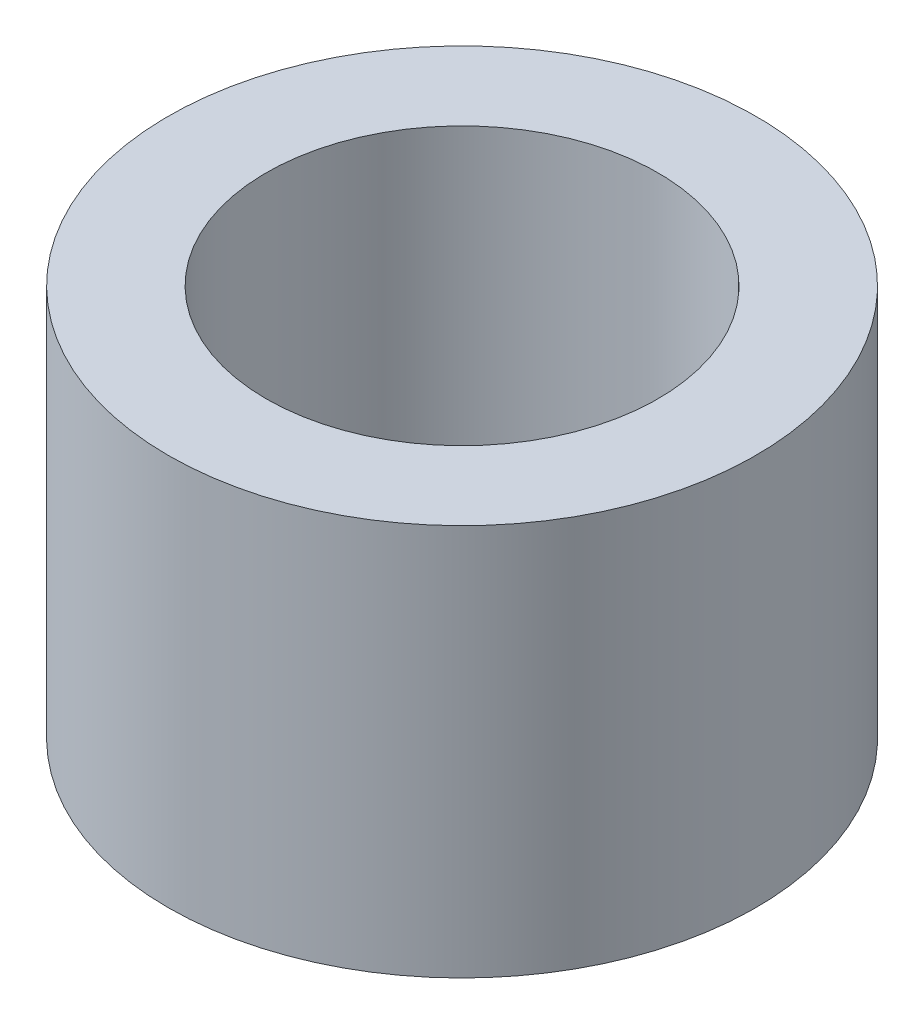
ISO-10303-21;
HEADER;
FILE_DESCRIPTION(('STEP AP214'),'2;1');
FILE_NAME('part.step','',(''),(''),'','','');
FILE_SCHEMA(('AUTOMOTIVE_DESIGN { 1 0 10303 214 1 1 1 1 }'));
ENDSEC;
DATA;
#1=APPLICATION_CONTEXT('core data for automotive mechanical design processes');
#2=APPLICATION_PROTOCOL_DEFINITION('international standard','automotive_design',2000,#1);
#3=PRODUCT_CONTEXT('',#1,'mechanical');
#4=PRODUCT('Part','Part','',(#3));
#5=PRODUCT_RELATED_PRODUCT_CATEGORY('part','',(#4));
#6=PRODUCT_DEFINITION_FORMATION('','',#4);
#7=PRODUCT_DEFINITION_CONTEXT('part definition',#1,'design');
#8=PRODUCT_DEFINITION('design','',#6,#7);
#9=PRODUCT_DEFINITION_SHAPE('','',#8);
#10=(LENGTH_UNIT() NAMED_UNIT(*) SI_UNIT(.MILLI.,.METRE.));
#11=(NAMED_UNIT(*) PLANE_ANGLE_UNIT() SI_UNIT($,.RADIAN.));
#12=(NAMED_UNIT(*) SI_UNIT($,.STERADIAN.) SOLID_ANGLE_UNIT());
#13=UNCERTAINTY_MEASURE_WITH_UNIT(LENGTH_MEASURE(1.E-05),#10,'distance_accuracy_value','');
#14=(GEOMETRIC_REPRESENTATION_CONTEXT(3) GLOBAL_UNCERTAINTY_ASSIGNED_CONTEXT((#13)) GLOBAL_UNIT_ASSIGNED_CONTEXT((#10,
#11,#12)) REPRESENTATION_CONTEXT('',''));
#15=CARTESIAN_POINT('',(0.,0.,0.));
#16=DIRECTION('',(0.,0.,1.));
#17=DIRECTION('',(1.,0.,0.));
#18=AXIS2_PLACEMENT_3D('',#15,#16,#17);
#19=CARTESIAN_POINT('',(0.,8.,0.));
#20=DIRECTION('',(0.,1.,0.));
#21=DIRECTION('',(0.,0.,1.));
#22=AXIS2_PLACEMENT_3D('',#19,#20,#21);
#23=PLANE('',#22);
#24=CARTESIAN_POINT('',(0.,8.,0.));
#25=DIRECTION('',(0.,1.,0.));
#26=DIRECTION('',(0.,0.,1.));
#27=AXIS2_PLACEMENT_3D('',#24,#25,#26);
#28=CIRCLE('',#27,6.);
#29=CARTESIAN_POINT('',(0.,8.,6.));
#30=VERTEX_POINT('',#29);
#31=EDGE_CURVE('E10',#30,#30,#28,.T.);
#32=ORIENTED_EDGE('',*,*,#31,.T.);
#33=EDGE_LOOP('',(#32));
#34=FACE_BOUND('',#33,.T.);
#35=CARTESIAN_POINT('',(0.,8.,0.));
#36=DIRECTION('',(0.,1.,0.));
#37=DIRECTION('',(0.,0.,1.));
#38=AXIS2_PLACEMENT_3D('',#35,#36,#37);
#39=CIRCLE('',#38,4.);
#40=CARTESIAN_POINT('',(0.,8.,4.));
#41=VERTEX_POINT('',#40);
#42=EDGE_CURVE('E48',#41,#41,#39,.T.);
#43=ORIENTED_EDGE('',*,*,#42,.F.);
#44=EDGE_LOOP('',(#43));
#45=FACE_BOUND('',#44,.T.);
#46=ADVANCED_FACE('F37',(#34,#45),#23,.T.);
#47=CARTESIAN_POINT('',(0.,0.,0.));
#48=DIRECTION('',(0.,1.,0.));
#49=DIRECTION('',(0.,0.,1.));
#50=AXIS2_PLACEMENT_3D('',#47,#48,#49);
#51=PLANE('',#50);
#52=CARTESIAN_POINT('',(0.,0.,0.));
#53=DIRECTION('',(0.,1.,0.));
#54=DIRECTION('',(0.,0.,1.));
#55=AXIS2_PLACEMENT_3D('',#52,#53,#54);
#56=CIRCLE('',#55,6.);
#57=CARTESIAN_POINT('',(0.,0.,6.));
#58=VERTEX_POINT('',#57);
#59=EDGE_CURVE('E41',#58,#58,#56,.T.);
#60=ORIENTED_EDGE('',*,*,#59,.F.);
#61=EDGE_LOOP('',(#60));
#62=FACE_BOUND('',#61,.T.);
#63=CARTESIAN_POINT('',(0.,0.,0.));
#64=DIRECTION('',(0.,1.,0.));
#65=DIRECTION('',(0.,0.,1.));
#66=AXIS2_PLACEMENT_3D('',#63,#64,#65);
#67=CIRCLE('',#66,4.);
#68=CARTESIAN_POINT('',(0.,0.,4.));
#69=VERTEX_POINT('',#68);
#70=EDGE_CURVE('E50',#69,#69,#67,.T.);
#71=ORIENTED_EDGE('',*,*,#70,.T.);
#72=EDGE_LOOP('',(#71));
#73=FACE_BOUND('',#72,.T.);
#74=ADVANCED_FACE('F60',(#62,#73),#51,.F.);
#75=CARTESIAN_POINT('',(0.,8.,0.));
#76=DIRECTION('',(0.,-1.,0.));
#77=DIRECTION('',(0.,0.,-1.));
#78=AXIS2_PLACEMENT_3D('',#75,#76,#77);
#79=CYLINDRICAL_SURFACE('',#78,6.);
#80=ORIENTED_EDGE('',*,*,#31,.F.);
#81=EDGE_LOOP('',(#80));
#82=FACE_BOUND('',#81,.T.);
#83=ORIENTED_EDGE('',*,*,#59,.T.);
#84=EDGE_LOOP('',(#83));
#85=FACE_BOUND('',#84,.T.);
#86=ADVANCED_FACE('F39',(#82,#85),#79,.T.);
#87=CARTESIAN_POINT('',(0.,8.,0.));
#88=DIRECTION('',(0.,-1.,0.));
#89=DIRECTION('',(0.,0.,-1.));
#90=AXIS2_PLACEMENT_3D('',#87,#88,#89);
#91=CYLINDRICAL_SURFACE('',#90,4.);
#92=ORIENTED_EDGE('',*,*,#42,.T.);
#93=EDGE_LOOP('',(#92));
#94=FACE_BOUND('',#93,.T.);
#95=ORIENTED_EDGE('',*,*,#70,.F.);
#96=EDGE_LOOP('',(#95));
#97=FACE_BOUND('',#96,.T.);
#98=ADVANCED_FACE('F56',(#94,#97),#91,.F.);
#99=CLOSED_SHELL('',(#46,#74,#86,#98));
#100=MANIFOLD_SOLID_BREP('B2',#99);
#101=ADVANCED_BREP_SHAPE_REPRESENTATION('',(#18,#100),#14);
#102=SHAPE_DEFINITION_REPRESENTATION(#9,#101);
ENDSEC;
END-ISO-10303-21;
